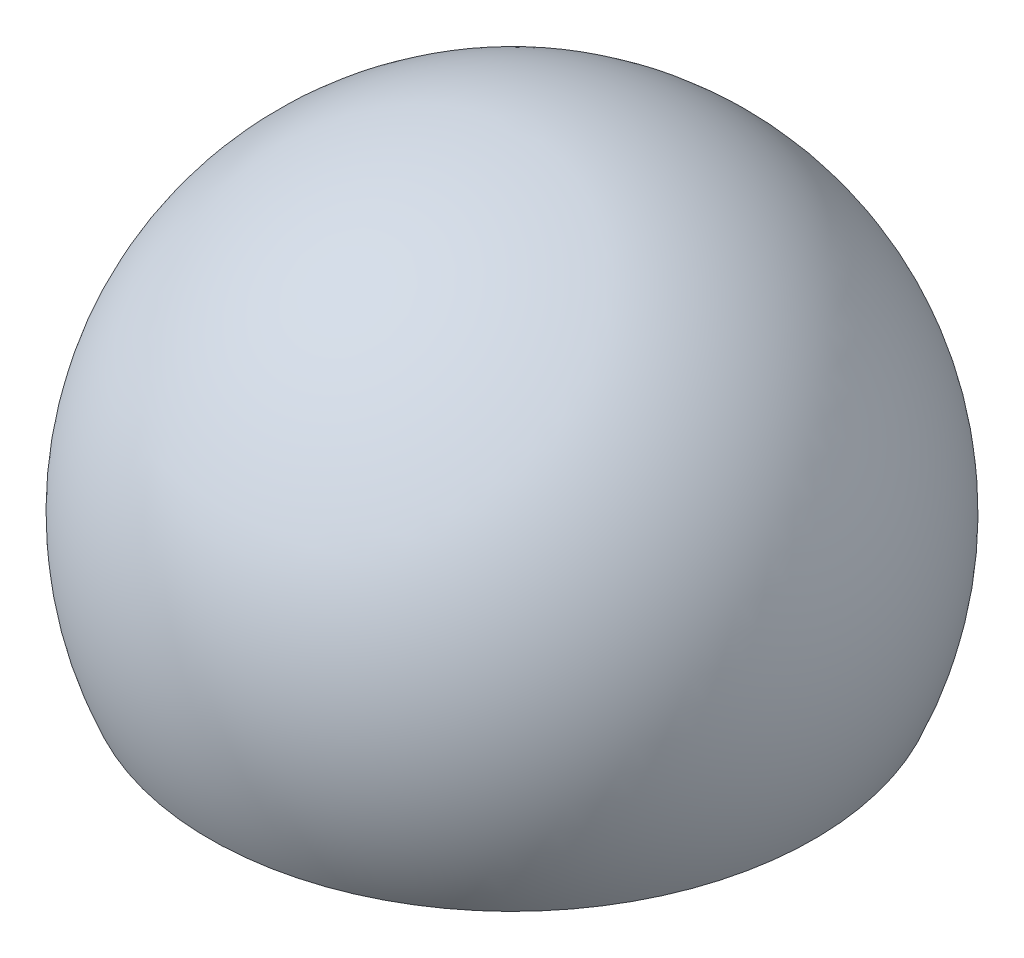
ISO-10303-21;
HEADER;
FILE_DESCRIPTION(('STEP AP214'),'2;1');
FILE_NAME('part.step','',(''),(''),'','','');
FILE_SCHEMA(('AUTOMOTIVE_DESIGN { 1 0 10303 214 1 1 1 1 }'));
ENDSEC;
DATA;
#1=APPLICATION_CONTEXT('core data for automotive mechanical design processes');
#2=APPLICATION_PROTOCOL_DEFINITION('international standard','automotive_design',2000,#1);
#3=PRODUCT_CONTEXT('',#1,'mechanical');
#4=PRODUCT('Part','Part','',(#3));
#5=PRODUCT_RELATED_PRODUCT_CATEGORY('part','',(#4));
#6=PRODUCT_DEFINITION_FORMATION('','',#4);
#7=PRODUCT_DEFINITION_CONTEXT('part definition',#1,'design');
#8=PRODUCT_DEFINITION('design','',#6,#7);
#9=PRODUCT_DEFINITION_SHAPE('','',#8);
#10=(LENGTH_UNIT() NAMED_UNIT(*) SI_UNIT(.MILLI.,.METRE.));
#11=(NAMED_UNIT(*) PLANE_ANGLE_UNIT() SI_UNIT($,.RADIAN.));
#12=(NAMED_UNIT(*) SI_UNIT($,.STERADIAN.) SOLID_ANGLE_UNIT());
#13=UNCERTAINTY_MEASURE_WITH_UNIT(LENGTH_MEASURE(1.E-05),#10,'distance_accuracy_value','');
#14=(GEOMETRIC_REPRESENTATION_CONTEXT(3) GLOBAL_UNCERTAINTY_ASSIGNED_CONTEXT((#13)) GLOBAL_UNIT_ASSIGNED_CONTEXT((#10,
#11,#12)) REPRESENTATION_CONTEXT('',''));
#15=CARTESIAN_POINT('',(0.,0.,0.));
#16=DIRECTION('',(0.,0.,1.));
#17=DIRECTION('',(1.,0.,0.));
#18=AXIS2_PLACEMENT_3D('',#15,#16,#17);
#19=CARTESIAN_POINT('',(0.,10.,0.));
#20=DIRECTION('',(0.,1.,0.));
#21=DIRECTION('',(0.,0.,1.));
#22=AXIS2_PLACEMENT_3D('',#19,#20,#21);
#23=PLANE('',#22);
#24=DIRECTION('',(-1.,0.,0.));
#25=VECTOR('',#24,1.);
#26=CARTESIAN_POINT('',(-5.48999999999999,10.,-5.49000000000001));
#27=LINE('',#26,#25);
#28=CARTESIAN_POINT('',(4.49,10.,-5.49000000000001));
#29=VERTEX_POINT('',#28);
#30=CARTESIAN_POINT('',(0.,10.,-5.49000000000001));
#31=VERTEX_POINT('',#30);
#32=EDGE_CURVE('E126',#29,#31,#27,.T.);
#33=ORIENTED_EDGE('',*,*,#32,.T.);
#34=CARTESIAN_POINT('',(0.,10.,0.));
#35=DIRECTION('',(0.,-1.,0.));
#36=DIRECTION('',(0.,0.,-1.));
#37=AXIS2_PLACEMENT_3D('',#34,#35,#36);
#38=CIRCLE('',#37,5.49);
#39=CARTESIAN_POINT('',(5.49,10.,0.));
#40=VERTEX_POINT('',#39);
#41=EDGE_CURVE('E50',#31,#40,#38,.T.);
#42=ORIENTED_EDGE('',*,*,#41,.T.);
#43=DIRECTION('',(0.,0.,-1.));
#44=VECTOR('',#43,1.);
#45=CARTESIAN_POINT('',(5.49000000000001,10.,-5.49000000000001));
#46=LINE('',#45,#44);
#47=CARTESIAN_POINT('',(5.49000000000001,10.,-4.49000000000001));
#48=VERTEX_POINT('',#47);
#49=EDGE_CURVE('E123',#40,#48,#46,.T.);
#50=ORIENTED_EDGE('',*,*,#49,.T.);
#51=CARTESIAN_POINT('',(4.49,10.,-4.49000000000001));
#52=DIRECTION('',(0.,1.,0.));
#53=DIRECTION('',(0.,0.,1.));
#54=AXIS2_PLACEMENT_3D('',#51,#52,#53);
#55=CIRCLE('',#54,1.);
#56=EDGE_CURVE('E187',#48,#29,#55,.T.);
#57=ORIENTED_EDGE('',*,*,#56,.T.);
#58=EDGE_LOOP('',(#33,#42,#50,#57));
#59=FACE_BOUND('',#58,.T.);
#60=ADVANCED_FACE('F39',(#59),#23,.T.);
#61=CARTESIAN_POINT('',(5.49000000000001,10.,4.48999999999999));
#62=VERTEX_POINT('',#61);
#63=EDGE_CURVE('E134',#62,#40,#46,.T.);
#64=ORIENTED_EDGE('',*,*,#63,.T.);
#65=CARTESIAN_POINT('',(0.,10.,5.48999999999999));
#66=VERTEX_POINT('',#65);
#67=EDGE_CURVE('E11',#40,#66,#38,.T.);
#68=ORIENTED_EDGE('',*,*,#67,.T.);
#69=DIRECTION('',(1.,0.,0.));
#70=VECTOR('',#69,1.);
#71=CARTESIAN_POINT('',(-5.48999999999999,10.,5.48999999999999));
#72=LINE('',#71,#70);
#73=CARTESIAN_POINT('',(4.49000000000001,10.,5.48999999999999));
#74=VERTEX_POINT('',#73);
#75=EDGE_CURVE('E152',#66,#74,#72,.T.);
#76=ORIENTED_EDGE('',*,*,#75,.T.);
#77=CARTESIAN_POINT('',(4.49000000000001,10.,4.48999999999999));
#78=DIRECTION('',(0.,1.,0.));
#79=DIRECTION('',(0.,0.,1.));
#80=AXIS2_PLACEMENT_3D('',#77,#78,#79);
#81=CIRCLE('',#80,1.);
#82=EDGE_CURVE('E142',#74,#62,#81,.T.);
#83=ORIENTED_EDGE('',*,*,#82,.T.);
#84=EDGE_LOOP('',(#64,#68,#76,#83));
#85=FACE_BOUND('',#84,.T.);
#86=ADVANCED_FACE('F140',(#85),#23,.T.);
#87=CARTESIAN_POINT('',(-4.48999999999999,10.,5.48999999999999));
#88=VERTEX_POINT('',#87);
#89=EDGE_CURVE('E153',#88,#66,#72,.T.);
#90=ORIENTED_EDGE('',*,*,#89,.T.);
#91=CARTESIAN_POINT('',(-5.49,10.,0.));
#92=VERTEX_POINT('',#91);
#93=EDGE_CURVE('E48',#66,#92,#38,.T.);
#94=ORIENTED_EDGE('',*,*,#93,.T.);
#95=DIRECTION('',(0.,0.,1.));
#96=VECTOR('',#95,1.);
#97=CARTESIAN_POINT('',(-5.48999999999999,10.,-5.49000000000001));
#98=LINE('',#97,#96);
#99=CARTESIAN_POINT('',(-5.48999999999999,10.,4.48999999999999));
#100=VERTEX_POINT('',#99);
#101=EDGE_CURVE('E148',#92,#100,#98,.T.);
#102=ORIENTED_EDGE('',*,*,#101,.T.);
#103=CARTESIAN_POINT('',(-4.48999999999999,10.,4.48999999999999));
#104=DIRECTION('',(0.,1.,0.));
#105=DIRECTION('',(0.,0.,1.));
#106=AXIS2_PLACEMENT_3D('',#103,#104,#105);
#107=CIRCLE('',#106,1.);
#108=EDGE_CURVE('E191',#100,#88,#107,.T.);
#109=ORIENTED_EDGE('',*,*,#108,.T.);
#110=EDGE_LOOP('',(#90,#94,#102,#109));
#111=FACE_BOUND('',#110,.T.);
#112=ADVANCED_FACE('F232',(#111),#23,.T.);
#113=CARTESIAN_POINT('',(5.49000000000001,10.,-5.49000000000001));
#114=DIRECTION('',(-1.,0.,0.));
#115=DIRECTION('',(0.,0.,1.));
#116=AXIS2_PLACEMENT_3D('',#113,#114,#115);
#117=PLANE('',#116);
#118=DIRECTION('',(0.,0.,-1.));
#119=VECTOR('',#118,1.);
#120=CARTESIAN_POINT('',(5.49000000000001,0.,-5.49000000000001));
#121=LINE('',#120,#119);
#122=CARTESIAN_POINT('',(5.49000000000001,0.,4.48999999999999));
#123=VERTEX_POINT('',#122);
#124=CARTESIAN_POINT('',(5.49000000000001,0.,-4.49000000000001));
#125=VERTEX_POINT('',#124);
#126=EDGE_CURVE('E157',#123,#125,#121,.T.);
#127=ORIENTED_EDGE('',*,*,#126,.T.);
#128=DIRECTION('',(0.,-1.,0.));
#129=VECTOR('',#128,1.);
#130=CARTESIAN_POINT('',(5.49000000000001,10.,-4.49000000000001));
#131=LINE('',#130,#129);
#132=EDGE_CURVE('E43',#125,#48,#131,.F.);
#133=ORIENTED_EDGE('',*,*,#132,.T.);
#134=ORIENTED_EDGE('',*,*,#49,.F.);
#135=ORIENTED_EDGE('',*,*,#63,.F.);
#136=DIRECTION('',(0.,-1.,0.));
#137=VECTOR('',#136,1.);
#138=CARTESIAN_POINT('',(5.49000000000001,10.,4.48999999999999));
#139=LINE('',#138,#137);
#140=EDGE_CURVE('E197',#62,#123,#139,.T.);
#141=ORIENTED_EDGE('',*,*,#140,.T.);
#142=EDGE_LOOP('',(#127,#133,#134,#135,#141));
#143=FACE_BOUND('',#142,.T.);
#144=ADVANCED_FACE('F132',(#143),#117,.F.);
#145=CARTESIAN_POINT('',(-5.48999999999999,10.,-5.49000000000001));
#146=DIRECTION('',(0.,0.,1.));
#147=DIRECTION('',(1.,0.,0.));
#148=AXIS2_PLACEMENT_3D('',#145,#146,#147);
#149=PLANE('',#148);
#150=DIRECTION('',(-1.,0.,0.));
#151=VECTOR('',#150,1.);
#152=CARTESIAN_POINT('',(-5.48999999999999,0.,-5.49000000000001));
#153=LINE('',#152,#151);
#154=CARTESIAN_POINT('',(4.49,0.,-5.49000000000001));
#155=VERTEX_POINT('',#154);
#156=CARTESIAN_POINT('',(-4.48999999999999,0.,-5.49000000000001));
#157=VERTEX_POINT('',#156);
#158=EDGE_CURVE('E159',#155,#157,#153,.T.);
#159=ORIENTED_EDGE('',*,*,#158,.T.);
#160=DIRECTION('',(0.,-1.,0.));
#161=VECTOR('',#160,1.);
#162=CARTESIAN_POINT('',(-4.48999999999999,10.,-5.49000000000001));
#163=LINE('',#162,#161);
#164=CARTESIAN_POINT('',(-4.48999999999999,10.,-5.49000000000001));
#165=VERTEX_POINT('',#164);
#166=EDGE_CURVE('E196',#157,#165,#163,.F.);
#167=ORIENTED_EDGE('',*,*,#166,.T.);
#168=EDGE_CURVE('E63',#31,#165,#27,.T.);
#169=ORIENTED_EDGE('',*,*,#168,.F.);
#170=ORIENTED_EDGE('',*,*,#32,.F.);
#171=DIRECTION('',(0.,-1.,0.));
#172=VECTOR('',#171,1.);
#173=CARTESIAN_POINT('',(4.49,10.,-5.49000000000001));
#174=LINE('',#173,#172);
#175=EDGE_CURVE('E193',#29,#155,#174,.T.);
#176=ORIENTED_EDGE('',*,*,#175,.T.);
#177=EDGE_LOOP('',(#159,#167,#169,#170,#176));
#178=FACE_BOUND('',#177,.T.);
#179=ADVANCED_FACE('F250',(#178),#149,.F.);
#180=CARTESIAN_POINT('',(-5.48999999999999,10.,-5.49000000000001));
#181=DIRECTION('',(1.,0.,0.));
#182=DIRECTION('',(0.,0.,-1.));
#183=AXIS2_PLACEMENT_3D('',#180,#181,#182);
#184=PLANE('',#183);
#185=DIRECTION('',(0.,0.,1.));
#186=VECTOR('',#185,1.);
#187=CARTESIAN_POINT('',(-5.48999999999999,0.,-5.49000000000001));
#188=LINE('',#187,#186);
#189=CARTESIAN_POINT('',(-5.48999999999999,0.,-4.49000000000001));
#190=VERTEX_POINT('',#189);
#191=CARTESIAN_POINT('',(-5.48999999999999,0.,4.48999999999999));
#192=VERTEX_POINT('',#191);
#193=EDGE_CURVE('E162',#190,#192,#188,.T.);
#194=ORIENTED_EDGE('',*,*,#193,.T.);
#195=DIRECTION('',(0.,-1.,0.));
#196=VECTOR('',#195,1.);
#197=CARTESIAN_POINT('',(-5.48999999999999,10.,4.48999999999999));
#198=LINE('',#197,#196);
#199=EDGE_CURVE('E183',#192,#100,#198,.F.);
#200=ORIENTED_EDGE('',*,*,#199,.T.);
#201=ORIENTED_EDGE('',*,*,#101,.F.);
#202=CARTESIAN_POINT('',(-5.48999999999999,10.,-4.49000000000001));
#203=VERTEX_POINT('',#202);
#204=EDGE_CURVE('E149',#203,#92,#98,.T.);
#205=ORIENTED_EDGE('',*,*,#204,.F.);
#206=DIRECTION('',(0.,-1.,0.));
#207=VECTOR('',#206,1.);
#208=CARTESIAN_POINT('',(-5.48999999999999,10.,-4.49000000000001));
#209=LINE('',#208,#207);
#210=EDGE_CURVE('E180',#203,#190,#209,.T.);
#211=ORIENTED_EDGE('',*,*,#210,.T.);
#212=EDGE_LOOP('',(#194,#200,#201,#205,#211));
#213=FACE_BOUND('',#212,.T.);
#214=ADVANCED_FACE('F242',(#213),#184,.F.);
#215=CARTESIAN_POINT('',(-5.48999999999999,10.,5.48999999999999));
#216=DIRECTION('',(0.,0.,-1.));
#217=DIRECTION('',(-1.,0.,0.));
#218=AXIS2_PLACEMENT_3D('',#215,#216,#217);
#219=PLANE('',#218);
#220=ORIENTED_EDGE('',*,*,#89,.F.);
#221=DIRECTION('',(0.,-1.,0.));
#222=VECTOR('',#221,1.);
#223=CARTESIAN_POINT('',(-4.48999999999999,10.,5.48999999999999));
#224=LINE('',#223,#222);
#225=CARTESIAN_POINT('',(-4.48999999999999,0.,5.48999999999999));
#226=VERTEX_POINT('',#225);
#227=EDGE_CURVE('E169',#88,#226,#224,.T.);
#228=ORIENTED_EDGE('',*,*,#227,.T.);
#229=DIRECTION('',(1.,0.,0.));
#230=VECTOR('',#229,1.);
#231=CARTESIAN_POINT('',(-5.48999999999999,0.,5.48999999999999));
#232=LINE('',#231,#230);
#233=CARTESIAN_POINT('',(4.49000000000001,0.,5.48999999999999));
#234=VERTEX_POINT('',#233);
#235=EDGE_CURVE('E138',#226,#234,#232,.T.);
#236=ORIENTED_EDGE('',*,*,#235,.T.);
#237=DIRECTION('',(0.,-1.,0.));
#238=VECTOR('',#237,1.);
#239=CARTESIAN_POINT('',(4.49000000000001,10.,5.48999999999999));
#240=LINE('',#239,#238);
#241=EDGE_CURVE('E156',#234,#74,#240,.F.);
#242=ORIENTED_EDGE('',*,*,#241,.T.);
#243=ORIENTED_EDGE('',*,*,#75,.F.);
#244=EDGE_LOOP('',(#220,#228,#236,#242,#243));
#245=FACE_BOUND('',#244,.T.);
#246=ADVANCED_FACE('F235',(#245),#219,.F.);
#247=ORIENTED_EDGE('',*,*,#204,.T.);
#248=EDGE_CURVE('E128',#92,#31,#38,.T.);
#249=ORIENTED_EDGE('',*,*,#248,.T.);
#250=ORIENTED_EDGE('',*,*,#168,.T.);
#251=CARTESIAN_POINT('',(-4.48999999999999,10.,-4.49000000000001));
#252=DIRECTION('',(0.,1.,0.));
#253=DIRECTION('',(0.,0.,1.));
#254=AXIS2_PLACEMENT_3D('',#251,#252,#253);
#255=CIRCLE('',#254,1.);
#256=EDGE_CURVE('E189',#165,#203,#255,.T.);
#257=ORIENTED_EDGE('',*,*,#256,.T.);
#258=EDGE_LOOP('',(#247,#249,#250,#257));
#259=FACE_BOUND('',#258,.T.);
#260=ADVANCED_FACE('F228',(#259),#23,.T.);
#261=CARTESIAN_POINT('',(0.,0.,0.));
#262=DIRECTION('',(0.,1.,0.));
#263=DIRECTION('',(0.,0.,1.));
#264=AXIS2_PLACEMENT_3D('',#261,#262,#263);
#265=PLANE('',#264);
#266=ORIENTED_EDGE('',*,*,#235,.F.);
#267=CARTESIAN_POINT('',(-4.48999999999999,0.,4.48999999999999));
#268=DIRECTION('',(0.,1.,0.));
#269=DIRECTION('',(0.,0.,1.));
#270=AXIS2_PLACEMENT_3D('',#267,#268,#269);
#271=CIRCLE('',#270,1.);
#272=EDGE_CURVE('E178',#226,#192,#271,.F.);
#273=ORIENTED_EDGE('',*,*,#272,.T.);
#274=ORIENTED_EDGE('',*,*,#193,.F.);
#275=CARTESIAN_POINT('',(-4.48999999999999,0.,-4.49000000000001));
#276=DIRECTION('',(0.,1.,0.));
#277=DIRECTION('',(0.,0.,1.));
#278=AXIS2_PLACEMENT_3D('',#275,#276,#277);
#279=CIRCLE('',#278,1.);
#280=EDGE_CURVE('E176',#190,#157,#279,.F.);
#281=ORIENTED_EDGE('',*,*,#280,.T.);
#282=ORIENTED_EDGE('',*,*,#158,.F.);
#283=CARTESIAN_POINT('',(4.49,0.,-4.49000000000001));
#284=DIRECTION('',(0.,1.,0.));
#285=DIRECTION('',(0.,0.,1.));
#286=AXIS2_PLACEMENT_3D('',#283,#284,#285);
#287=CIRCLE('',#286,1.);
#288=EDGE_CURVE('E174',#155,#125,#287,.F.);
#289=ORIENTED_EDGE('',*,*,#288,.T.);
#290=ORIENTED_EDGE('',*,*,#126,.F.);
#291=CARTESIAN_POINT('',(4.49000000000001,0.,4.48999999999999));
#292=DIRECTION('',(0.,1.,0.));
#293=DIRECTION('',(0.,0.,1.));
#294=AXIS2_PLACEMENT_3D('',#291,#292,#293);
#295=CIRCLE('',#294,1.);
#296=EDGE_CURVE('E172',#123,#234,#295,.F.);
#297=ORIENTED_EDGE('',*,*,#296,.T.);
#298=EDGE_LOOP('',(#266,#273,#274,#281,#282,#289,#290,#297));
#299=FACE_BOUND('',#298,.T.);
#300=ADVANCED_FACE('F234',(#299),#265,.F.);
#301=CARTESIAN_POINT('',(-4.48999999999999,10.,4.48999999999999));
#302=DIRECTION('',(0.,-1.,0.));
#303=DIRECTION('',(0.,0.,-1.));
#304=AXIS2_PLACEMENT_3D('',#301,#302,#303);
#305=CYLINDRICAL_SURFACE('',#304,1.);
#306=ORIENTED_EDGE('',*,*,#108,.F.);
#307=ORIENTED_EDGE('',*,*,#199,.F.);
#308=ORIENTED_EDGE('',*,*,#272,.F.);
#309=ORIENTED_EDGE('',*,*,#227,.F.);
#310=EDGE_LOOP('',(#306,#307,#308,#309));
#311=FACE_BOUND('',#310,.T.);
#312=ADVANCED_FACE('F240',(#311),#305,.T.);
#313=CARTESIAN_POINT('',(-4.48999999999999,10.,-4.49000000000001));
#314=DIRECTION('',(0.,-1.,0.));
#315=DIRECTION('',(0.,0.,-1.));
#316=AXIS2_PLACEMENT_3D('',#313,#314,#315);
#317=CYLINDRICAL_SURFACE('',#316,1.);
#318=ORIENTED_EDGE('',*,*,#256,.F.);
#319=ORIENTED_EDGE('',*,*,#166,.F.);
#320=ORIENTED_EDGE('',*,*,#280,.F.);
#321=ORIENTED_EDGE('',*,*,#210,.F.);
#322=EDGE_LOOP('',(#318,#319,#320,#321));
#323=FACE_BOUND('',#322,.T.);
#324=ADVANCED_FACE('F265',(#323),#317,.T.);
#325=CARTESIAN_POINT('',(4.49,10.,-4.49000000000001));
#326=DIRECTION('',(0.,-1.,0.));
#327=DIRECTION('',(0.,0.,-1.));
#328=AXIS2_PLACEMENT_3D('',#325,#326,#327);
#329=CYLINDRICAL_SURFACE('',#328,1.);
#330=ORIENTED_EDGE('',*,*,#56,.F.);
#331=ORIENTED_EDGE('',*,*,#132,.F.);
#332=ORIENTED_EDGE('',*,*,#288,.F.);
#333=ORIENTED_EDGE('',*,*,#175,.F.);
#334=EDGE_LOOP('',(#330,#331,#332,#333));
#335=FACE_BOUND('',#334,.T.);
#336=ADVANCED_FACE('F224',(#335),#329,.T.);
#337=CARTESIAN_POINT('',(4.49000000000001,10.,4.48999999999999));
#338=DIRECTION('',(0.,-1.,0.));
#339=DIRECTION('',(0.,0.,-1.));
#340=AXIS2_PLACEMENT_3D('',#337,#338,#339);
#341=CYLINDRICAL_SURFACE('',#340,1.);
#342=ORIENTED_EDGE('',*,*,#82,.F.);
#343=ORIENTED_EDGE('',*,*,#241,.F.);
#344=ORIENTED_EDGE('',*,*,#296,.F.);
#345=ORIENTED_EDGE('',*,*,#140,.F.);
#346=EDGE_LOOP('',(#342,#343,#344,#345));
#347=FACE_BOUND('',#346,.T.);
#348=ADVANCED_FACE('F41',(#347),#341,.T.);
#349=CARTESIAN_POINT('',(0.,10.,0.));
#350=DIRECTION('',(0.,-1.,0.));
#351=DIRECTION('',(0.,0.,-1.));
#352=AXIS2_PLACEMENT_3D('',#349,#350,#351);
#353=SPHERICAL_SURFACE('',#352,25.);
#354=CARTESIAN_POINT('',(0.,0.,0.));
#355=DIRECTION('',(0.,-1.,0.));
#356=DIRECTION('',(0.,0.,-1.));
#357=AXIS2_PLACEMENT_3D('',#354,#355,#356);
#358=CIRCLE('',#357,22.9128784747792);
#359=CARTESIAN_POINT('',(0.,0.,-22.9128784747792));
#360=VERTEX_POINT('',#359);
#361=EDGE_CURVE('E145',#360,#360,#358,.T.);
#362=ORIENTED_EDGE('',*,*,#361,.F.);
#363=EDGE_LOOP('',(#362));
#364=FACE_BOUND('',#363,.T.);
#365=ADVANCED_FACE('F214',(#364),#353,.T.);
#366=CARTESIAN_POINT('',(0.,0.,-22.9128784747792));
#367=DIRECTION('',(0.,-1.,0.));
#368=DIRECTION('',(0.,0.,-1.));
#369=AXIS2_PLACEMENT_3D('',#366,#367,#368);
#370=PLANE('',#369);
#371=ORIENTED_EDGE('',*,*,#361,.T.);
#372=EDGE_LOOP('',(#371));
#373=FACE_BOUND('',#372,.T.);
#374=CARTESIAN_POINT('',(0.,0.,0.));
#375=DIRECTION('',(0.,-1.,0.));
#376=DIRECTION('',(0.,0.,-1.));
#377=AXIS2_PLACEMENT_3D('',#374,#375,#376);
#378=CIRCLE('',#377,11.);
#379=CARTESIAN_POINT('',(0.,0.,-11.));
#380=VERTEX_POINT('',#379);
#381=EDGE_CURVE('E204',#380,#380,#378,.T.);
#382=ORIENTED_EDGE('',*,*,#381,.F.);
#383=EDGE_LOOP('',(#382));
#384=FACE_BOUND('',#383,.T.);
#385=ADVANCED_FACE('F211',(#373,#384),#370,.T.);
#386=CARTESIAN_POINT('',(0.,10.,0.));
#387=DIRECTION('',(0.,-1.,0.));
#388=DIRECTION('',(0.,0.,-1.));
#389=AXIS2_PLACEMENT_3D('',#386,#387,#388);
#390=CYLINDRICAL_SURFACE('',#389,11.);
#391=ORIENTED_EDGE('',*,*,#381,.T.);
#392=EDGE_LOOP('',(#391));
#393=FACE_BOUND('',#392,.T.);
#394=CARTESIAN_POINT('',(0.,10.,0.));
#395=DIRECTION('',(0.,-1.,0.));
#396=DIRECTION('',(0.,0.,-1.));
#397=AXIS2_PLACEMENT_3D('',#394,#395,#396);
#398=CIRCLE('',#397,11.);
#399=CARTESIAN_POINT('',(0.,10.,-11.));
#400=VERTEX_POINT('',#399);
#401=EDGE_CURVE('E202',#400,#400,#398,.T.);
#402=ORIENTED_EDGE('',*,*,#401,.F.);
#403=EDGE_LOOP('',(#402));
#404=FACE_BOUND('',#403,.T.);
#405=ADVANCED_FACE('F221',(#393,#404),#390,.F.);
#406=CARTESIAN_POINT('',(0.,10.,0.));
#407=DIRECTION('',(0.,-1.,0.));
#408=DIRECTION('',(0.,0.,-1.));
#409=AXIS2_PLACEMENT_3D('',#406,#407,#408);
#410=SPHERICAL_SURFACE('',#409,11.);
#411=ORIENTED_EDGE('',*,*,#401,.T.);
#412=EDGE_LOOP('',(#411));
#413=FACE_BOUND('',#412,.T.);
#414=CARTESIAN_POINT('',(0.,19.5320459503718,0.));
#415=DIRECTION('',(0.,-1.,0.));
#416=DIRECTION('',(0.,0.,-1.));
#417=AXIS2_PLACEMENT_3D('',#414,#415,#416);
#418=CIRCLE('',#417,5.49000000000001);
#419=CARTESIAN_POINT('',(0.,19.5320459503718,-5.49000000000001));
#420=VERTEX_POINT('',#419);
#421=EDGE_CURVE('E127',#420,#420,#418,.T.);
#422=ORIENTED_EDGE('',*,*,#421,.F.);
#423=EDGE_LOOP('',(#422));
#424=FACE_BOUND('',#423,.T.);
#425=ADVANCED_FACE('F358',(#413,#424),#410,.F.);
#426=CARTESIAN_POINT('',(0.,10.,0.));
#427=DIRECTION('',(0.,-1.,0.));
#428=DIRECTION('',(0.,0.,-1.));
#429=AXIS2_PLACEMENT_3D('',#426,#427,#428);
#430=CYLINDRICAL_SURFACE('',#429,5.49);
#431=ORIENTED_EDGE('',*,*,#421,.T.);
#432=EDGE_LOOP('',(#431));
#433=FACE_BOUND('',#432,.T.);
#434=ORIENTED_EDGE('',*,*,#41,.F.);
#435=ORIENTED_EDGE('',*,*,#248,.F.);
#436=ORIENTED_EDGE('',*,*,#93,.F.);
#437=ORIENTED_EDGE('',*,*,#67,.F.);
#438=EDGE_LOOP('',(#434,#435,#436,#437));
#439=FACE_BOUND('',#438,.T.);
#440=ADVANCED_FACE('F115',(#433,#439),#430,.T.);
#441=CLOSED_SHELL('',(#60,#86,#112,#144,#179,#214,#246,#260,#300,#312,#324,#336,#348,#365,#385,
#405,#425,#440));
#442=MANIFOLD_SOLID_BREP('B2',#441);
#443=ADVANCED_BREP_SHAPE_REPRESENTATION('',(#18,#442),#14);
#444=SHAPE_DEFINITION_REPRESENTATION(#9,#443);
ENDSEC;
END-ISO-10303-21;
